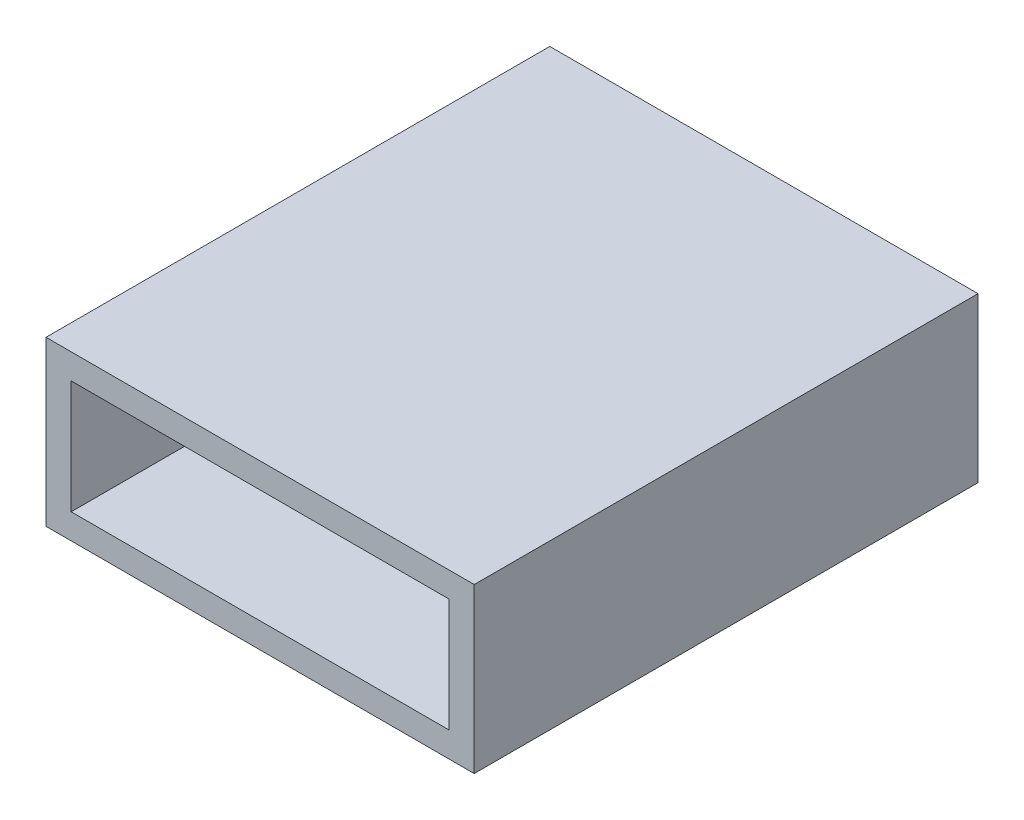
ISO-10303-21;
HEADER;
FILE_DESCRIPTION(('STEP AP214'),'2;1');
FILE_NAME('part.step','',(''),(''),'','','');
FILE_SCHEMA(('AUTOMOTIVE_DESIGN { 1 0 10303 214 1 1 1 1 }'));
ENDSEC;
DATA;
#1=APPLICATION_CONTEXT('core data for automotive mechanical design processes');
#2=APPLICATION_PROTOCOL_DEFINITION('international standard','automotive_design',2000,#1);
#3=PRODUCT_CONTEXT('',#1,'mechanical');
#4=PRODUCT('Part','Part','',(#3));
#5=PRODUCT_RELATED_PRODUCT_CATEGORY('part','',(#4));
#6=PRODUCT_DEFINITION_FORMATION('','',#4);
#7=PRODUCT_DEFINITION_CONTEXT('part definition',#1,'design');
#8=PRODUCT_DEFINITION('design','',#6,#7);
#9=PRODUCT_DEFINITION_SHAPE('','',#8);
#10=(LENGTH_UNIT() NAMED_UNIT(*) SI_UNIT(.MILLI.,.METRE.));
#11=(NAMED_UNIT(*) PLANE_ANGLE_UNIT() SI_UNIT($,.RADIAN.));
#12=(NAMED_UNIT(*) SI_UNIT($,.STERADIAN.) SOLID_ANGLE_UNIT());
#13=UNCERTAINTY_MEASURE_WITH_UNIT(LENGTH_MEASURE(1.E-05),#10,'distance_accuracy_value','');
#14=(GEOMETRIC_REPRESENTATION_CONTEXT(3) GLOBAL_UNCERTAINTY_ASSIGNED_CONTEXT((#13)) GLOBAL_UNIT_ASSIGNED_CONTEXT((#10,
#11,#12)) REPRESENTATION_CONTEXT('',''));
#15=CARTESIAN_POINT('',(0.,0.,0.));
#16=DIRECTION('',(0.,0.,1.));
#17=DIRECTION('',(1.,0.,0.));
#18=AXIS2_PLACEMENT_3D('',#15,#16,#17);
#19=CARTESIAN_POINT('',(0.,0.,0.));
#20=DIRECTION('',(0.,0.,-1.));
#21=DIRECTION('',(-1.,0.,0.));
#22=AXIS2_PLACEMENT_3D('',#19,#20,#21);
#23=PLANE('',#22);
#24=DIRECTION('',(-1.,0.,0.));
#25=VECTOR('',#24,1.);
#26=CARTESIAN_POINT('',(-17.,6.5,0.));
#27=LINE('',#26,#25);
#28=CARTESIAN_POINT('',(17.,6.5,0.));
#29=VERTEX_POINT('',#28);
#30=CARTESIAN_POINT('',(-17.,6.5,0.));
#31=VERTEX_POINT('',#30);
#32=EDGE_CURVE('E149',#29,#31,#27,.T.);
#33=ORIENTED_EDGE('',*,*,#32,.F.);
#34=DIRECTION('',(0.,1.,0.));
#35=VECTOR('',#34,1.);
#36=CARTESIAN_POINT('',(17.,6.5,0.));
#37=LINE('',#36,#35);
#38=CARTESIAN_POINT('',(17.,-6.5,0.));
#39=VERTEX_POINT('',#38);
#40=EDGE_CURVE('E97',#39,#29,#37,.T.);
#41=ORIENTED_EDGE('',*,*,#40,.F.);
#42=DIRECTION('',(1.,0.,0.));
#43=VECTOR('',#42,1.);
#44=CARTESIAN_POINT('',(5.5,-6.5,0.));
#45=LINE('',#44,#43);
#46=CARTESIAN_POINT('',(5.5,-6.5,0.));
#47=VERTEX_POINT('',#46);
#48=EDGE_CURVE('E241',#47,#39,#45,.T.);
#49=ORIENTED_EDGE('',*,*,#48,.F.);
#50=DIRECTION('',(0.,-1.,0.));
#51=VECTOR('',#50,1.);
#52=CARTESIAN_POINT('',(5.5,-5.5,0.));
#53=LINE('',#52,#51);
#54=CARTESIAN_POINT('',(5.5,-5.5,0.));
#55=VERTEX_POINT('',#54);
#56=EDGE_CURVE('E238',#55,#47,#53,.T.);
#57=ORIENTED_EDGE('',*,*,#56,.F.);
#58=DIRECTION('',(1.,0.,0.));
#59=VECTOR('',#58,1.);
#60=CARTESIAN_POINT('',(-5.5,-5.5,0.));
#61=LINE('',#60,#59);
#62=CARTESIAN_POINT('',(-5.5,-5.5,0.));
#63=VERTEX_POINT('',#62);
#64=EDGE_CURVE('E235',#63,#55,#61,.T.);
#65=ORIENTED_EDGE('',*,*,#64,.F.);
#66=DIRECTION('',(0.,1.,0.));
#67=VECTOR('',#66,1.);
#68=CARTESIAN_POINT('',(-5.5,-5.5,0.));
#69=LINE('',#68,#67);
#70=CARTESIAN_POINT('',(-5.5,-6.5,0.));
#71=VERTEX_POINT('',#70);
#72=EDGE_CURVE('E232',#71,#63,#69,.T.);
#73=ORIENTED_EDGE('',*,*,#72,.F.);
#74=DIRECTION('',(1.,0.,0.));
#75=VECTOR('',#74,1.);
#76=CARTESIAN_POINT('',(-17.,-6.5,0.));
#77=LINE('',#76,#75);
#78=CARTESIAN_POINT('',(-17.,-6.5,0.));
#79=VERTEX_POINT('',#78);
#80=EDGE_CURVE('E229',#79,#71,#77,.T.);
#81=ORIENTED_EDGE('',*,*,#80,.F.);
#82=DIRECTION('',(0.,-1.,0.));
#83=VECTOR('',#82,1.);
#84=CARTESIAN_POINT('',(-17.,6.5,0.));
#85=LINE('',#84,#83);
#86=EDGE_CURVE('E226',#31,#79,#85,.T.);
#87=ORIENTED_EDGE('',*,*,#86,.F.);
#88=EDGE_LOOP('',(#33,#41,#49,#57,#65,#73,#81,#87));
#89=FACE_BOUND('',#88,.T.);
#90=DIRECTION('',(-1.,0.,0.));
#91=VECTOR('',#90,1.);
#92=CARTESIAN_POINT('',(-15.,4.5,0.));
#93=LINE('',#92,#91);
#94=CARTESIAN_POINT('',(15.,4.5,0.));
#95=VERTEX_POINT('',#94);
#96=CARTESIAN_POINT('',(-15.,4.5,0.));
#97=VERTEX_POINT('',#96);
#98=EDGE_CURVE('E199',#95,#97,#93,.T.);
#99=ORIENTED_EDGE('',*,*,#98,.T.);
#100=DIRECTION('',(0.,-1.,0.));
#101=VECTOR('',#100,1.);
#102=CARTESIAN_POINT('',(-15.,4.5,0.));
#103=LINE('',#102,#101);
#104=CARTESIAN_POINT('',(-15.,-4.5,0.));
#105=VERTEX_POINT('',#104);
#106=EDGE_CURVE('E55',#97,#105,#103,.T.);
#107=ORIENTED_EDGE('',*,*,#106,.T.);
#108=DIRECTION('',(1.,0.,0.));
#109=VECTOR('',#108,1.);
#110=CARTESIAN_POINT('',(-15.,-4.5,0.));
#111=LINE('',#110,#109);
#112=CARTESIAN_POINT('',(15.,-4.5,0.));
#113=VERTEX_POINT('',#112);
#114=EDGE_CURVE('E147',#105,#113,#111,.T.);
#115=ORIENTED_EDGE('',*,*,#114,.T.);
#116=DIRECTION('',(0.,1.,0.));
#117=VECTOR('',#116,1.);
#118=CARTESIAN_POINT('',(15.,4.5,0.));
#119=LINE('',#118,#117);
#120=EDGE_CURVE('E195',#113,#95,#119,.T.);
#121=ORIENTED_EDGE('',*,*,#120,.T.);
#122=EDGE_LOOP('',(#99,#107,#115,#121));
#123=FACE_BOUND('',#122,.T.);
#124=ADVANCED_FACE('F39',(#89,#123),#23,.T.);
#125=CARTESIAN_POINT('',(-17.,6.5,4.));
#126=DIRECTION('',(0.,-1.,0.));
#127=DIRECTION('',(0.,0.,-1.));
#128=AXIS2_PLACEMENT_3D('',#125,#126,#127);
#129=PLANE('',#128);
#130=ORIENTED_EDGE('',*,*,#32,.T.);
#131=DIRECTION('',(0.,0.,-1.));
#132=VECTOR('',#131,1.);
#133=CARTESIAN_POINT('',(-17.,6.5,4.));
#134=LINE('',#133,#132);
#135=CARTESIAN_POINT('',(-17.,6.5,40.));
#136=VERTEX_POINT('',#135);
#137=EDGE_CURVE('E11',#136,#31,#134,.T.);
#138=ORIENTED_EDGE('',*,*,#137,.F.);
#139=DIRECTION('',(-1.,0.,0.));
#140=VECTOR('',#139,1.);
#141=CARTESIAN_POINT('',(-17.,6.5,40.));
#142=LINE('',#141,#140);
#143=CARTESIAN_POINT('',(17.,6.5,40.));
#144=VERTEX_POINT('',#143);
#145=EDGE_CURVE('E185',#144,#136,#142,.T.);
#146=ORIENTED_EDGE('',*,*,#145,.F.);
#147=DIRECTION('',(0.,0.,-1.));
#148=VECTOR('',#147,1.);
#149=CARTESIAN_POINT('',(17.,6.5,4.));
#150=LINE('',#149,#148);
#151=EDGE_CURVE('E222',#144,#29,#150,.T.);
#152=ORIENTED_EDGE('',*,*,#151,.T.);
#153=EDGE_LOOP('',(#130,#138,#146,#152));
#154=FACE_BOUND('',#153,.T.);
#155=ADVANCED_FACE('F41',(#154),#129,.F.);
#156=CARTESIAN_POINT('',(-17.,6.5,4.));
#157=DIRECTION('',(1.,0.,0.));
#158=DIRECTION('',(0.,0.,-1.));
#159=AXIS2_PLACEMENT_3D('',#156,#157,#158);
#160=PLANE('',#159);
#161=ORIENTED_EDGE('',*,*,#86,.T.);
#162=DIRECTION('',(0.,0.,-1.));
#163=VECTOR('',#162,1.);
#164=CARTESIAN_POINT('',(-17.,-6.5,4.));
#165=LINE('',#164,#163);
#166=CARTESIAN_POINT('',(-17.,-6.5,40.));
#167=VERTEX_POINT('',#166);
#168=EDGE_CURVE('E48',#167,#79,#165,.T.);
#169=ORIENTED_EDGE('',*,*,#168,.F.);
#170=DIRECTION('',(0.,-1.,0.));
#171=VECTOR('',#170,1.);
#172=CARTESIAN_POINT('',(-17.,6.5,40.));
#173=LINE('',#172,#171);
#174=EDGE_CURVE('E173',#136,#167,#173,.T.);
#175=ORIENTED_EDGE('',*,*,#174,.F.);
#176=ORIENTED_EDGE('',*,*,#137,.T.);
#177=EDGE_LOOP('',(#161,#169,#175,#176));
#178=FACE_BOUND('',#177,.T.);
#179=ADVANCED_FACE('F288',(#178),#160,.F.);
#180=CARTESIAN_POINT('',(-5.5,-5.5,4.));
#181=DIRECTION('',(-1.,0.,0.));
#182=DIRECTION('',(0.,0.,1.));
#183=AXIS2_PLACEMENT_3D('',#180,#181,#182);
#184=PLANE('',#183);
#185=ORIENTED_EDGE('',*,*,#72,.T.);
#186=DIRECTION('',(0.,0.,-1.));
#187=VECTOR('',#186,1.);
#188=CARTESIAN_POINT('',(-5.5,-5.5,4.));
#189=LINE('',#188,#187);
#190=CARTESIAN_POINT('',(-5.5,-5.5,4.));
#191=VERTEX_POINT('',#190);
#192=EDGE_CURVE('E257',#191,#63,#189,.T.);
#193=ORIENTED_EDGE('',*,*,#192,.F.);
#194=DIRECTION('',(0.,1.,0.));
#195=VECTOR('',#194,1.);
#196=CARTESIAN_POINT('',(-5.5,-5.5,4.));
#197=LINE('',#196,#195);
#198=CARTESIAN_POINT('',(-5.5,-6.5,4.));
#199=VERTEX_POINT('',#198);
#200=EDGE_CURVE('E210',#199,#191,#197,.T.);
#201=ORIENTED_EDGE('',*,*,#200,.F.);
#202=DIRECTION('',(0.,0.,-1.));
#203=VECTOR('',#202,1.);
#204=CARTESIAN_POINT('',(-5.5,-6.5,4.));
#205=LINE('',#204,#203);
#206=EDGE_CURVE('E103',#199,#71,#205,.T.);
#207=ORIENTED_EDGE('',*,*,#206,.T.);
#208=EDGE_LOOP('',(#185,#193,#201,#207));
#209=FACE_BOUND('',#208,.T.);
#210=ADVANCED_FACE('F276',(#209),#184,.F.);
#211=CARTESIAN_POINT('',(-5.5,-5.5,4.));
#212=DIRECTION('',(0.,1.,0.));
#213=DIRECTION('',(0.,0.,1.));
#214=AXIS2_PLACEMENT_3D('',#211,#212,#213);
#215=PLANE('',#214);
#216=ORIENTED_EDGE('',*,*,#64,.T.);
#217=DIRECTION('',(0.,0.,-1.));
#218=VECTOR('',#217,1.);
#219=CARTESIAN_POINT('',(5.5,-5.5,4.));
#220=LINE('',#219,#218);
#221=CARTESIAN_POINT('',(5.5,-5.5,4.));
#222=VERTEX_POINT('',#221);
#223=EDGE_CURVE('E64',#222,#55,#220,.T.);
#224=ORIENTED_EDGE('',*,*,#223,.F.);
#225=DIRECTION('',(1.,0.,0.));
#226=VECTOR('',#225,1.);
#227=CARTESIAN_POINT('',(-5.5,-5.5,4.));
#228=LINE('',#227,#226);
#229=EDGE_CURVE('E214',#191,#222,#228,.T.);
#230=ORIENTED_EDGE('',*,*,#229,.F.);
#231=ORIENTED_EDGE('',*,*,#192,.T.);
#232=EDGE_LOOP('',(#216,#224,#230,#231));
#233=FACE_BOUND('',#232,.T.);
#234=ADVANCED_FACE('F277',(#233),#215,.F.);
#235=CARTESIAN_POINT('',(5.5,-5.5,4.));
#236=DIRECTION('',(1.,0.,0.));
#237=DIRECTION('',(0.,1.,0.));
#238=AXIS2_PLACEMENT_3D('',#235,#236,#237);
#239=PLANE('',#238);
#240=ORIENTED_EDGE('',*,*,#56,.T.);
#241=DIRECTION('',(0.,0.,-1.));
#242=VECTOR('',#241,1.);
#243=CARTESIAN_POINT('',(5.5,-6.5,4.));
#244=LINE('',#243,#242);
#245=CARTESIAN_POINT('',(5.5,-6.5,4.));
#246=VERTEX_POINT('',#245);
#247=EDGE_CURVE('E251',#246,#47,#244,.T.);
#248=ORIENTED_EDGE('',*,*,#247,.F.);
#249=DIRECTION('',(0.,-1.,0.));
#250=VECTOR('',#249,1.);
#251=CARTESIAN_POINT('',(5.5,-5.5,4.));
#252=LINE('',#251,#250);
#253=EDGE_CURVE('E218',#222,#246,#252,.T.);
#254=ORIENTED_EDGE('',*,*,#253,.F.);
#255=ORIENTED_EDGE('',*,*,#223,.T.);
#256=EDGE_LOOP('',(#240,#248,#254,#255));
#257=FACE_BOUND('',#256,.T.);
#258=ADVANCED_FACE('F306',(#257),#239,.F.);
#259=CARTESIAN_POINT('',(5.5,-6.5,4.));
#260=DIRECTION('',(0.,1.,0.));
#261=DIRECTION('',(0.,0.,1.));
#262=AXIS2_PLACEMENT_3D('',#259,#260,#261);
#263=PLANE('',#262);
#264=ORIENTED_EDGE('',*,*,#48,.T.);
#265=DIRECTION('',(0.,0.,-1.));
#266=VECTOR('',#265,1.);
#267=CARTESIAN_POINT('',(17.,-6.5,4.));
#268=LINE('',#267,#266);
#269=CARTESIAN_POINT('',(17.,-6.5,40.));
#270=VERTEX_POINT('',#269);
#271=EDGE_CURVE('E248',#270,#39,#268,.T.);
#272=ORIENTED_EDGE('',*,*,#271,.F.);
#273=DIRECTION('',(1.,0.,0.));
#274=VECTOR('',#273,1.);
#275=CARTESIAN_POINT('',(-17.,-6.5,40.));
#276=LINE('',#275,#274);
#277=EDGE_CURVE('E177',#167,#270,#276,.T.);
#278=ORIENTED_EDGE('',*,*,#277,.F.);
#279=ORIENTED_EDGE('',*,*,#168,.T.);
#280=ORIENTED_EDGE('',*,*,#80,.T.);
#281=ORIENTED_EDGE('',*,*,#206,.F.);
#282=DIRECTION('',(1.,0.,0.));
#283=VECTOR('',#282,1.);
#284=CARTESIAN_POINT('',(-17.,-6.5,4.));
#285=LINE('',#284,#283);
#286=EDGE_CURVE('E172',#199,#246,#285,.T.);
#287=ORIENTED_EDGE('',*,*,#286,.T.);
#288=ORIENTED_EDGE('',*,*,#247,.T.);
#289=EDGE_LOOP('',(#264,#272,#278,#279,#280,#281,#287,#288));
#290=FACE_BOUND('',#289,.T.);
#291=ADVANCED_FACE('F266',(#290),#263,.F.);
#292=CARTESIAN_POINT('',(17.,6.5,4.));
#293=DIRECTION('',(-1.,0.,0.));
#294=DIRECTION('',(0.,-1.,0.));
#295=AXIS2_PLACEMENT_3D('',#292,#293,#294);
#296=PLANE('',#295);
#297=ORIENTED_EDGE('',*,*,#40,.T.);
#298=ORIENTED_EDGE('',*,*,#151,.F.);
#299=DIRECTION('',(0.,1.,0.));
#300=VECTOR('',#299,1.);
#301=CARTESIAN_POINT('',(17.,6.5,40.));
#302=LINE('',#301,#300);
#303=EDGE_CURVE('E181',#270,#144,#302,.T.);
#304=ORIENTED_EDGE('',*,*,#303,.F.);
#305=ORIENTED_EDGE('',*,*,#271,.T.);
#306=EDGE_LOOP('',(#297,#298,#304,#305));
#307=FACE_BOUND('',#306,.T.);
#308=ADVANCED_FACE('F286',(#307),#296,.F.);
#309=CARTESIAN_POINT('',(-15.,4.5,4.));
#310=DIRECTION('',(1.,0.,0.));
#311=DIRECTION('',(0.,1.,0.));
#312=AXIS2_PLACEMENT_3D('',#309,#310,#311);
#313=PLANE('',#312);
#314=ORIENTED_EDGE('',*,*,#106,.F.);
#315=DIRECTION('',(0.,0.,-1.));
#316=VECTOR('',#315,1.);
#317=CARTESIAN_POINT('',(-15.,4.5,4.));
#318=LINE('',#317,#316);
#319=CARTESIAN_POINT('',(-15.,4.5,40.));
#320=VERTEX_POINT('',#319);
#321=EDGE_CURVE('E155',#320,#97,#318,.T.);
#322=ORIENTED_EDGE('',*,*,#321,.F.);
#323=DIRECTION('',(0.,-1.,0.));
#324=VECTOR('',#323,1.);
#325=CARTESIAN_POINT('',(-15.,4.5,40.));
#326=LINE('',#325,#324);
#327=CARTESIAN_POINT('',(-15.,-4.5,40.));
#328=VERTEX_POINT('',#327);
#329=EDGE_CURVE('E153',#320,#328,#326,.T.);
#330=ORIENTED_EDGE('',*,*,#329,.T.);
#331=DIRECTION('',(0.,0.,-1.));
#332=VECTOR('',#331,1.);
#333=CARTESIAN_POINT('',(-15.,-4.5,4.));
#334=LINE('',#333,#332);
#335=EDGE_CURVE('E140',#328,#105,#334,.T.);
#336=ORIENTED_EDGE('',*,*,#335,.T.);
#337=EDGE_LOOP('',(#314,#322,#330,#336));
#338=FACE_BOUND('',#337,.T.);
#339=ADVANCED_FACE('F154',(#338),#313,.T.);
#340=CARTESIAN_POINT('',(-15.,-4.5,4.));
#341=DIRECTION('',(0.,1.,0.));
#342=DIRECTION('',(0.,0.,1.));
#343=AXIS2_PLACEMENT_3D('',#340,#341,#342);
#344=PLANE('',#343);
#345=ORIENTED_EDGE('',*,*,#114,.F.);
#346=ORIENTED_EDGE('',*,*,#335,.F.);
#347=DIRECTION('',(1.,0.,0.));
#348=VECTOR('',#347,1.);
#349=CARTESIAN_POINT('',(-15.,-4.5,40.));
#350=LINE('',#349,#348);
#351=CARTESIAN_POINT('',(15.,-4.5,40.));
#352=VERTEX_POINT('',#351);
#353=EDGE_CURVE('E144',#328,#352,#350,.T.);
#354=ORIENTED_EDGE('',*,*,#353,.T.);
#355=DIRECTION('',(0.,0.,-1.));
#356=VECTOR('',#355,1.);
#357=CARTESIAN_POINT('',(15.,-4.5,4.));
#358=LINE('',#357,#356);
#359=EDGE_CURVE('E150',#352,#113,#358,.T.);
#360=ORIENTED_EDGE('',*,*,#359,.T.);
#361=EDGE_LOOP('',(#345,#346,#354,#360));
#362=FACE_BOUND('',#361,.T.);
#363=ADVANCED_FACE('F142',(#362),#344,.T.);
#364=CARTESIAN_POINT('',(15.,4.5,4.));
#365=DIRECTION('',(-1.,0.,0.));
#366=DIRECTION('',(0.,-1.,0.));
#367=AXIS2_PLACEMENT_3D('',#364,#365,#366);
#368=PLANE('',#367);
#369=ORIENTED_EDGE('',*,*,#120,.F.);
#370=ORIENTED_EDGE('',*,*,#359,.F.);
#371=DIRECTION('',(0.,1.,0.));
#372=VECTOR('',#371,1.);
#373=CARTESIAN_POINT('',(15.,4.5,40.));
#374=LINE('',#373,#372);
#375=CARTESIAN_POINT('',(15.,4.5,40.));
#376=VERTEX_POINT('',#375);
#377=EDGE_CURVE('E163',#352,#376,#374,.T.);
#378=ORIENTED_EDGE('',*,*,#377,.T.);
#379=DIRECTION('',(0.,0.,-1.));
#380=VECTOR('',#379,1.);
#381=CARTESIAN_POINT('',(15.,4.5,4.));
#382=LINE('',#381,#380);
#383=EDGE_CURVE('E205',#376,#95,#382,.T.);
#384=ORIENTED_EDGE('',*,*,#383,.T.);
#385=EDGE_LOOP('',(#369,#370,#378,#384));
#386=FACE_BOUND('',#385,.T.);
#387=ADVANCED_FACE('F337',(#386),#368,.T.);
#388=CARTESIAN_POINT('',(-15.,4.5,4.));
#389=DIRECTION('',(0.,-1.,0.));
#390=DIRECTION('',(0.,0.,-1.));
#391=AXIS2_PLACEMENT_3D('',#388,#389,#390);
#392=PLANE('',#391);
#393=ORIENTED_EDGE('',*,*,#98,.F.);
#394=ORIENTED_EDGE('',*,*,#383,.F.);
#395=DIRECTION('',(-1.,0.,0.));
#396=VECTOR('',#395,1.);
#397=CARTESIAN_POINT('',(-15.,4.5,40.));
#398=LINE('',#397,#396);
#399=EDGE_CURVE('E167',#376,#320,#398,.T.);
#400=ORIENTED_EDGE('',*,*,#399,.T.);
#401=ORIENTED_EDGE('',*,*,#321,.T.);
#402=EDGE_LOOP('',(#393,#394,#400,#401));
#403=FACE_BOUND('',#402,.T.);
#404=ADVANCED_FACE('F343',(#403),#392,.T.);
#405=CARTESIAN_POINT('',(0.,0.,4.));
#406=DIRECTION('',(0.,0.,1.));
#407=DIRECTION('',(1.,0.,0.));
#408=AXIS2_PLACEMENT_3D('',#405,#406,#407);
#409=PLANE('',#408);
#410=ORIENTED_EDGE('',*,*,#286,.F.);
#411=ORIENTED_EDGE('',*,*,#200,.T.);
#412=ORIENTED_EDGE('',*,*,#229,.T.);
#413=ORIENTED_EDGE('',*,*,#253,.T.);
#414=EDGE_LOOP('',(#410,#411,#412,#413));
#415=FACE_BOUND('',#414,.T.);
#416=ADVANCED_FACE('F280',(#415),#409,.F.);
#417=CARTESIAN_POINT('',(0.,0.,40.));
#418=DIRECTION('',(0.,0.,1.));
#419=DIRECTION('',(1.,0.,0.));
#420=AXIS2_PLACEMENT_3D('',#417,#418,#419);
#421=PLANE('',#420);
#422=ORIENTED_EDGE('',*,*,#174,.T.);
#423=ORIENTED_EDGE('',*,*,#277,.T.);
#424=ORIENTED_EDGE('',*,*,#303,.T.);
#425=ORIENTED_EDGE('',*,*,#145,.T.);
#426=EDGE_LOOP('',(#422,#423,#424,#425));
#427=FACE_BOUND('',#426,.T.);
#428=ORIENTED_EDGE('',*,*,#353,.F.);
#429=ORIENTED_EDGE('',*,*,#329,.F.);
#430=ORIENTED_EDGE('',*,*,#399,.F.);
#431=ORIENTED_EDGE('',*,*,#377,.F.);
#432=EDGE_LOOP('',(#428,#429,#430,#431));
#433=FACE_BOUND('',#432,.T.);
#434=ADVANCED_FACE('F161',(#427,#433),#421,.T.);
#435=CLOSED_SHELL('',(#124,#155,#179,#210,#234,#258,#291,#308,#339,#363,#387,#404,#416,#434));
#436=MANIFOLD_SOLID_BREP('B2',#435);
#437=ADVANCED_BREP_SHAPE_REPRESENTATION('',(#18,#436),#14);
#438=SHAPE_DEFINITION_REPRESENTATION(#9,#437);
ENDSEC;
END-ISO-10303-21;
